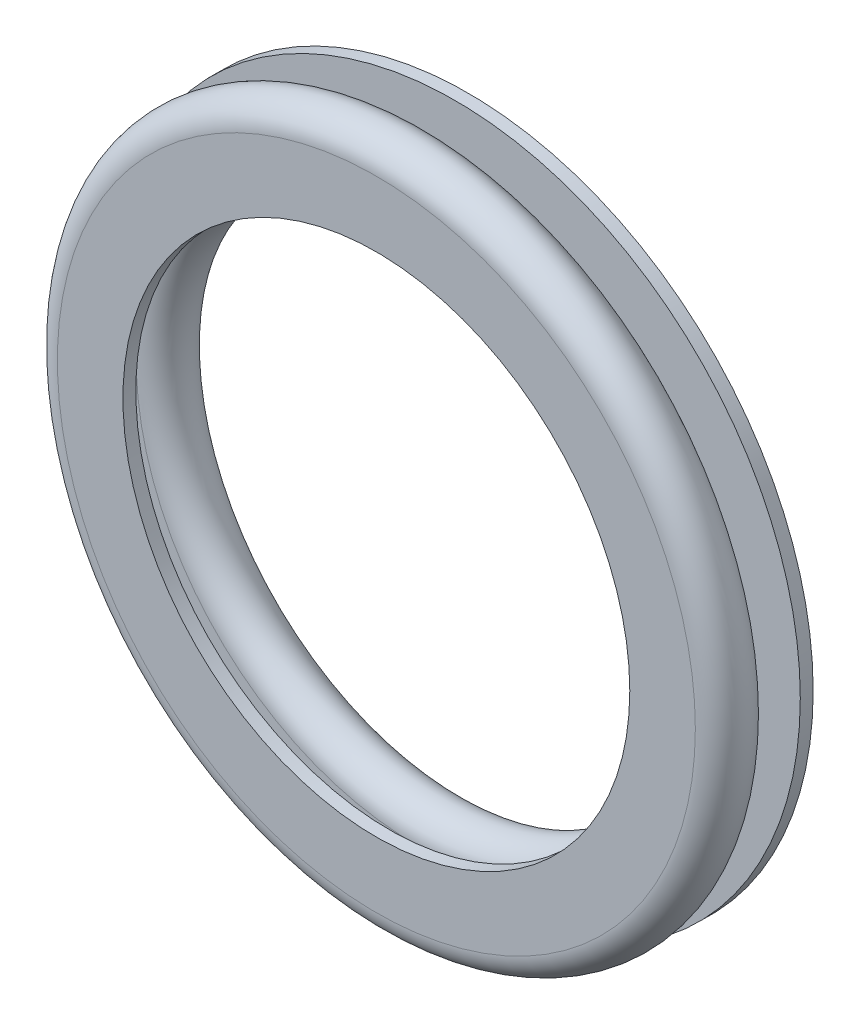
ISO-10303-21;
HEADER;
FILE_DESCRIPTION(('STEP AP214'),'2;1');
FILE_NAME('part.step','',(''),(''),'','','');
FILE_SCHEMA(('AUTOMOTIVE_DESIGN { 1 0 10303 214 1 1 1 1 }'));
ENDSEC;
DATA;
#1=APPLICATION_CONTEXT('core data for automotive mechanical design processes');
#2=APPLICATION_PROTOCOL_DEFINITION('international standard','automotive_design',2000,#1);
#3=PRODUCT_CONTEXT('',#1,'mechanical');
#4=PRODUCT('Part','Part','',(#3));
#5=PRODUCT_RELATED_PRODUCT_CATEGORY('part','',(#4));
#6=PRODUCT_DEFINITION_FORMATION('','',#4);
#7=PRODUCT_DEFINITION_CONTEXT('part definition',#1,'design');
#8=PRODUCT_DEFINITION('design','',#6,#7);
#9=PRODUCT_DEFINITION_SHAPE('','',#8);
#10=(LENGTH_UNIT() NAMED_UNIT(*) SI_UNIT(.MILLI.,.METRE.));
#11=(NAMED_UNIT(*) PLANE_ANGLE_UNIT() SI_UNIT($,.RADIAN.));
#12=(NAMED_UNIT(*) SI_UNIT($,.STERADIAN.) SOLID_ANGLE_UNIT());
#13=UNCERTAINTY_MEASURE_WITH_UNIT(LENGTH_MEASURE(1.E-05),#10,'distance_accuracy_value','');
#14=(GEOMETRIC_REPRESENTATION_CONTEXT(3) GLOBAL_UNCERTAINTY_ASSIGNED_CONTEXT((#13)) GLOBAL_UNIT_ASSIGNED_CONTEXT((#10,
#11,#12)) REPRESENTATION_CONTEXT('',''));
#15=CARTESIAN_POINT('',(0.,0.,0.));
#16=DIRECTION('',(0.,0.,1.));
#17=DIRECTION('',(1.,0.,0.));
#18=AXIS2_PLACEMENT_3D('',#15,#16,#17);
#19=CARTESIAN_POINT('',(0.,0.,0.));
#20=DIRECTION('',(0.,0.,1.));
#21=DIRECTION('',(1.,0.,0.));
#22=AXIS2_PLACEMENT_3D('',#19,#20,#21);
#23=CYLINDRICAL_SURFACE('',#22,4.92);
#24=CARTESIAN_POINT('',(0.,0.,-0.25));
#25=DIRECTION('',(0.,0.,1.));
#26=DIRECTION('',(1.,0.,0.));
#27=AXIS2_PLACEMENT_3D('',#24,#25,#26);
#28=CIRCLE('',#27,4.92);
#29=CARTESIAN_POINT('',(4.92,0.,-0.25));
#30=VERTEX_POINT('',#29);
#31=EDGE_CURVE('E54',#30,#30,#28,.T.);
#32=ORIENTED_EDGE('',*,*,#31,.F.);
#33=EDGE_LOOP('',(#32));
#34=FACE_BOUND('',#33,.T.);
#35=CARTESIAN_POINT('',(0.,0.,0.));
#36=DIRECTION('',(0.,0.,1.));
#37=DIRECTION('',(1.,0.,0.));
#38=AXIS2_PLACEMENT_3D('',#35,#36,#37);
#39=CIRCLE('',#38,4.92);
#40=CARTESIAN_POINT('',(4.92,0.,0.));
#41=VERTEX_POINT('',#40);
#42=EDGE_CURVE('E10',#41,#41,#39,.T.);
#43=ORIENTED_EDGE('',*,*,#42,.T.);
#44=EDGE_LOOP('',(#43));
#45=FACE_BOUND('',#44,.T.);
#46=ADVANCED_FACE('F14',(#34,#45),#23,.F.);
#47=CARTESIAN_POINT('',(0.,4.92,0.));
#48=DIRECTION('',(0.,0.,-1.));
#49=DIRECTION('',(-1.,0.,0.));
#50=AXIS2_PLACEMENT_3D('',#47,#48,#49);
#51=PLANE('',#50);
#52=ORIENTED_EDGE('',*,*,#42,.F.);
#53=EDGE_LOOP('',(#52));
#54=FACE_BOUND('',#53,.T.);
#55=CARTESIAN_POINT('',(0.,0.,0.));
#56=DIRECTION('',(0.,0.,1.));
#57=DIRECTION('',(1.,0.,0.));
#58=AXIS2_PLACEMENT_3D('',#55,#56,#57);
#59=CIRCLE('',#58,6.1925);
#60=CARTESIAN_POINT('',(6.1925,0.,0.));
#61=VERTEX_POINT('',#60);
#62=EDGE_CURVE('E20',#61,#61,#59,.T.);
#63=ORIENTED_EDGE('',*,*,#62,.T.);
#64=EDGE_LOOP('',(#63));
#65=FACE_BOUND('',#64,.T.);
#66=ADVANCED_FACE('F61',(#54,#65),#51,.F.);
#67=CARTESIAN_POINT('',(0.,0.,-0.507500000000003));
#68=DIRECTION('',(0.,0.,1.));
#69=DIRECTION('',(1.,0.,0.));
#70=AXIS2_PLACEMENT_3D('',#67,#68,#69);
#71=TOROIDAL_SURFACE('',#70,6.1925,0.507500000000001);
#72=ORIENTED_EDGE('',*,*,#62,.F.);
#73=EDGE_LOOP('',(#72));
#74=FACE_BOUND('',#73,.T.);
#75=CARTESIAN_POINT('',(0.,0.,-1.015));
#76=DIRECTION('',(0.,0.,1.));
#77=DIRECTION('',(1.,0.,0.));
#78=AXIS2_PLACEMENT_3D('',#75,#76,#77);
#79=CIRCLE('',#78,6.1925);
#80=CARTESIAN_POINT('',(6.1925,0.,-1.015));
#81=VERTEX_POINT('',#80);
#82=EDGE_CURVE('E24',#81,#81,#79,.T.);
#83=ORIENTED_EDGE('',*,*,#82,.T.);
#84=EDGE_LOOP('',(#83));
#85=FACE_BOUND('',#84,.T.);
#86=ADVANCED_FACE('F66',(#74,#85),#71,.T.);
#87=CARTESIAN_POINT('',(0.,6.1925,-1.015));
#88=DIRECTION('',(0.,0.,1.));
#89=DIRECTION('',(1.,0.,0.));
#90=AXIS2_PLACEMENT_3D('',#87,#88,#89);
#91=PLANE('',#90);
#92=ORIENTED_EDGE('',*,*,#82,.F.);
#93=EDGE_LOOP('',(#92));
#94=FACE_BOUND('',#93,.T.);
#95=CARTESIAN_POINT('',(0.,0.,-1.015));
#96=DIRECTION('',(0.,0.,1.));
#97=DIRECTION('',(1.,0.,0.));
#98=AXIS2_PLACEMENT_3D('',#95,#96,#97);
#99=CIRCLE('',#98,5.4275);
#100=CARTESIAN_POINT('',(5.4275,0.,-1.015));
#101=VERTEX_POINT('',#100);
#102=EDGE_CURVE('E28',#101,#101,#99,.T.);
#103=ORIENTED_EDGE('',*,*,#102,.T.);
#104=EDGE_LOOP('',(#103));
#105=FACE_BOUND('',#104,.T.);
#106=ADVANCED_FACE('F71',(#94,#105),#91,.F.);
#107=CARTESIAN_POINT('',(0.,0.,-1.2725));
#108=DIRECTION('',(0.,0.,1.));
#109=DIRECTION('',(1.,0.,0.));
#110=AXIS2_PLACEMENT_3D('',#107,#108,#109);
#111=TOROIDAL_SURFACE('',#110,5.4275,0.257499999999999);
#112=ORIENTED_EDGE('',*,*,#102,.F.);
#113=EDGE_LOOP('',(#112));
#114=FACE_BOUND('',#113,.T.);
#115=CARTESIAN_POINT('',(0.,0.,-1.53));
#116=DIRECTION('',(0.,0.,1.));
#117=DIRECTION('',(1.,0.,0.));
#118=AXIS2_PLACEMENT_3D('',#115,#116,#117);
#119=CIRCLE('',#118,5.4275);
#120=CARTESIAN_POINT('',(5.4275,0.,-1.53));
#121=VERTEX_POINT('',#120);
#122=EDGE_CURVE('E33',#121,#121,#119,.T.);
#123=ORIENTED_EDGE('',*,*,#122,.T.);
#124=EDGE_LOOP('',(#123));
#125=FACE_BOUND('',#124,.T.);
#126=ADVANCED_FACE('F77',(#114,#125),#111,.F.);
#127=CARTESIAN_POINT('',(0.,5.4275,-1.53));
#128=DIRECTION('',(0.,0.,-1.));
#129=DIRECTION('',(-1.,0.,0.));
#130=AXIS2_PLACEMENT_3D('',#127,#128,#129);
#131=PLANE('',#130);
#132=ORIENTED_EDGE('',*,*,#122,.F.);
#133=EDGE_LOOP('',(#132));
#134=FACE_BOUND('',#133,.T.);
#135=CARTESIAN_POINT('',(0.,0.,-1.53));
#136=DIRECTION('',(0.,0.,1.));
#137=DIRECTION('',(1.,0.,0.));
#138=AXIS2_PLACEMENT_3D('',#135,#136,#137);
#139=CIRCLE('',#138,6.7);
#140=CARTESIAN_POINT('',(6.7,0.,-1.53));
#141=VERTEX_POINT('',#140);
#142=EDGE_CURVE('E36',#141,#141,#139,.T.);
#143=ORIENTED_EDGE('',*,*,#142,.T.);
#144=EDGE_LOOP('',(#143));
#145=FACE_BOUND('',#144,.T.);
#146=ADVANCED_FACE('F81',(#134,#145),#131,.F.);
#147=CARTESIAN_POINT('',(0.,0.,0.));
#148=DIRECTION('',(0.,0.,1.));
#149=DIRECTION('',(1.,0.,0.));
#150=AXIS2_PLACEMENT_3D('',#147,#148,#149);
#151=CYLINDRICAL_SURFACE('',#150,6.7);
#152=ORIENTED_EDGE('',*,*,#142,.F.);
#153=EDGE_LOOP('',(#152));
#154=FACE_BOUND('',#153,.T.);
#155=CARTESIAN_POINT('',(0.,0.,-1.78));
#156=DIRECTION('',(0.,0.,1.));
#157=DIRECTION('',(1.,0.,0.));
#158=AXIS2_PLACEMENT_3D('',#155,#156,#157);
#159=CIRCLE('',#158,6.7);
#160=CARTESIAN_POINT('',(6.7,0.,-1.78));
#161=VERTEX_POINT('',#160);
#162=EDGE_CURVE('E39',#161,#161,#159,.T.);
#163=ORIENTED_EDGE('',*,*,#162,.T.);
#164=EDGE_LOOP('',(#163));
#165=FACE_BOUND('',#164,.T.);
#166=ADVANCED_FACE('F85',(#154,#165),#151,.T.);
#167=CARTESIAN_POINT('',(0.,5.4275,-1.78));
#168=DIRECTION('',(0.,0.,1.));
#169=DIRECTION('',(1.,0.,0.));
#170=AXIS2_PLACEMENT_3D('',#167,#168,#169);
#171=PLANE('',#170);
#172=ORIENTED_EDGE('',*,*,#162,.F.);
#173=EDGE_LOOP('',(#172));
#174=FACE_BOUND('',#173,.T.);
#175=CARTESIAN_POINT('',(0.,0.,-1.78));
#176=DIRECTION('',(0.,0.,1.));
#177=DIRECTION('',(1.,0.,0.));
#178=AXIS2_PLACEMENT_3D('',#175,#176,#177);
#179=CIRCLE('',#178,5.4275);
#180=CARTESIAN_POINT('',(5.4275,0.,-1.78));
#181=VERTEX_POINT('',#180);
#182=EDGE_CURVE('E42',#181,#181,#179,.T.);
#183=ORIENTED_EDGE('',*,*,#182,.T.);
#184=EDGE_LOOP('',(#183));
#185=FACE_BOUND('',#184,.T.);
#186=ADVANCED_FACE('F89',(#174,#185),#171,.F.);
#187=CARTESIAN_POINT('',(0.,0.,-1.2725));
#188=DIRECTION('',(0.,0.,1.));
#189=DIRECTION('',(1.,0.,0.));
#190=AXIS2_PLACEMENT_3D('',#187,#188,#189);
#191=TOROIDAL_SURFACE('',#190,5.4275,0.507500000000001);
#192=ORIENTED_EDGE('',*,*,#182,.F.);
#193=EDGE_LOOP('',(#192));
#194=FACE_BOUND('',#193,.T.);
#195=CARTESIAN_POINT('',(0.,0.,-0.765000000000003));
#196=DIRECTION('',(0.,0.,1.));
#197=DIRECTION('',(1.,0.,0.));
#198=AXIS2_PLACEMENT_3D('',#195,#196,#197);
#199=CIRCLE('',#198,5.4275);
#200=CARTESIAN_POINT('',(5.4275,0.,-0.765000000000003));
#201=VERTEX_POINT('',#200);
#202=EDGE_CURVE('E45',#201,#201,#199,.T.);
#203=ORIENTED_EDGE('',*,*,#202,.T.);
#204=EDGE_LOOP('',(#203));
#205=FACE_BOUND('',#204,.T.);
#206=ADVANCED_FACE('F93',(#194,#205),#191,.T.);
#207=CARTESIAN_POINT('',(0.,6.1925,-0.765000000000003));
#208=DIRECTION('',(0.,0.,-1.));
#209=DIRECTION('',(-1.,0.,0.));
#210=AXIS2_PLACEMENT_3D('',#207,#208,#209);
#211=PLANE('',#210);
#212=ORIENTED_EDGE('',*,*,#202,.F.);
#213=EDGE_LOOP('',(#212));
#214=FACE_BOUND('',#213,.T.);
#215=CARTESIAN_POINT('',(0.,0.,-0.765000000000004));
#216=DIRECTION('',(0.,0.,1.));
#217=DIRECTION('',(1.,0.,0.));
#218=AXIS2_PLACEMENT_3D('',#215,#216,#217);
#219=CIRCLE('',#218,6.1925);
#220=CARTESIAN_POINT('',(6.1925,0.,-0.765000000000004));
#221=VERTEX_POINT('',#220);
#222=EDGE_CURVE('E48',#221,#221,#219,.T.);
#223=ORIENTED_EDGE('',*,*,#222,.T.);
#224=EDGE_LOOP('',(#223));
#225=FACE_BOUND('',#224,.T.);
#226=ADVANCED_FACE('F97',(#214,#225),#211,.F.);
#227=CARTESIAN_POINT('',(0.,0.,-0.507500000000003));
#228=DIRECTION('',(0.,0.,1.));
#229=DIRECTION('',(1.,0.,0.));
#230=AXIS2_PLACEMENT_3D('',#227,#228,#229);
#231=TOROIDAL_SURFACE('',#230,6.1925,0.257500000000002);
#232=ORIENTED_EDGE('',*,*,#222,.F.);
#233=EDGE_LOOP('',(#232));
#234=FACE_BOUND('',#233,.T.);
#235=CARTESIAN_POINT('',(0.,0.,-0.250000000000001));
#236=DIRECTION('',(0.,0.,1.));
#237=DIRECTION('',(1.,0.,0.));
#238=AXIS2_PLACEMENT_3D('',#235,#236,#237);
#239=CIRCLE('',#238,6.1925);
#240=CARTESIAN_POINT('',(6.1925,0.,-0.250000000000001));
#241=VERTEX_POINT('',#240);
#242=EDGE_CURVE('E51',#241,#241,#239,.T.);
#243=ORIENTED_EDGE('',*,*,#242,.T.);
#244=EDGE_LOOP('',(#243));
#245=FACE_BOUND('',#244,.T.);
#246=ADVANCED_FACE('F101',(#234,#245),#231,.F.);
#247=CARTESIAN_POINT('',(0.,4.92,-0.250000000000001));
#248=DIRECTION('',(0.,0.,1.));
#249=DIRECTION('',(1.,0.,0.));
#250=AXIS2_PLACEMENT_3D('',#247,#248,#249);
#251=PLANE('',#250);
#252=ORIENTED_EDGE('',*,*,#242,.F.);
#253=EDGE_LOOP('',(#252));
#254=FACE_BOUND('',#253,.T.);
#255=ORIENTED_EDGE('',*,*,#31,.T.);
#256=EDGE_LOOP('',(#255));
#257=FACE_BOUND('',#256,.T.);
#258=ADVANCED_FACE('F58',(#254,#257),#251,.F.);
#259=CLOSED_SHELL('',(#46,#66,#86,#106,#126,#146,#166,#186,#206,#226,#246,#258));
#260=MANIFOLD_SOLID_BREP('B1',#259);
#261=ADVANCED_BREP_SHAPE_REPRESENTATION('',(#18,#260),#14);
#262=SHAPE_DEFINITION_REPRESENTATION(#9,#261);
ENDSEC;
END-ISO-10303-21;
